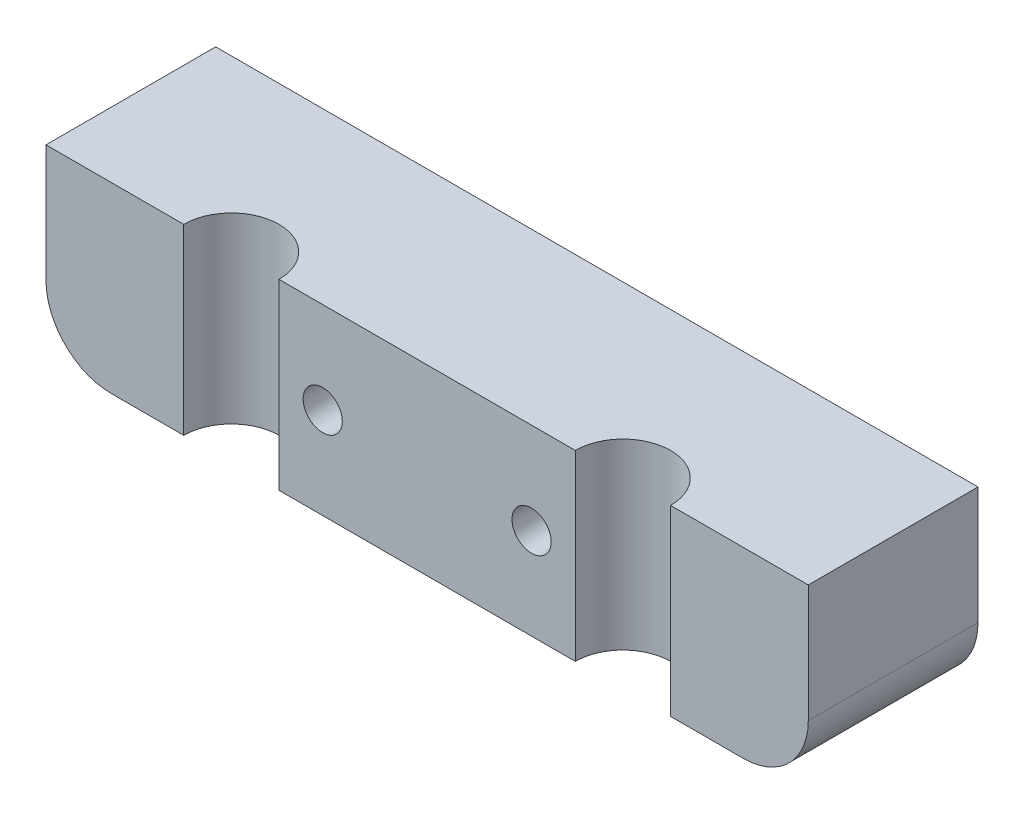
ISO-10303-21;
HEADER;
FILE_DESCRIPTION(('STEP AP214'),'2;1');
FILE_NAME('part.step','',(''),(''),'','','');
FILE_SCHEMA(('AUTOMOTIVE_DESIGN { 1 0 10303 214 1 1 1 1 }'));
ENDSEC;
DATA;
#1=APPLICATION_CONTEXT('core data for automotive mechanical design processes');
#2=APPLICATION_PROTOCOL_DEFINITION('international standard','automotive_design',2000,#1);
#3=PRODUCT_CONTEXT('',#1,'mechanical');
#4=PRODUCT('Part','Part','',(#3));
#5=PRODUCT_RELATED_PRODUCT_CATEGORY('part','',(#4));
#6=PRODUCT_DEFINITION_FORMATION('','',#4);
#7=PRODUCT_DEFINITION_CONTEXT('part definition',#1,'design');
#8=PRODUCT_DEFINITION('design','',#6,#7);
#9=PRODUCT_DEFINITION_SHAPE('','',#8);
#10=(LENGTH_UNIT() NAMED_UNIT(*) SI_UNIT(.MILLI.,.METRE.));
#11=(NAMED_UNIT(*) PLANE_ANGLE_UNIT() SI_UNIT($,.RADIAN.));
#12=(NAMED_UNIT(*) SI_UNIT($,.STERADIAN.) SOLID_ANGLE_UNIT());
#13=UNCERTAINTY_MEASURE_WITH_UNIT(LENGTH_MEASURE(1.E-05),#10,'distance_accuracy_value','');
#14=(GEOMETRIC_REPRESENTATION_CONTEXT(3) GLOBAL_UNCERTAINTY_ASSIGNED_CONTEXT((#13)) GLOBAL_UNIT_ASSIGNED_CONTEXT((#10,
#11,#12)) REPRESENTATION_CONTEXT('',''));
#15=CARTESIAN_POINT('',(0.,0.,0.));
#16=DIRECTION('',(0.,0.,1.));
#17=DIRECTION('',(1.,0.,0.));
#18=AXIS2_PLACEMENT_3D('',#15,#16,#17);
#19=CARTESIAN_POINT('',(8.,0.,-0.000999999999999265));
#20=DIRECTION('',(0.,0.,1.));
#21=DIRECTION('',(1.,0.,0.));
#22=AXIS2_PLACEMENT_3D('',#19,#20,#21);
#23=CYLINDRICAL_SURFACE('',#22,1.5);
#24=CARTESIAN_POINT('',(8.,0.,13.));
#25=DIRECTION('',(0.,0.,1.));
#26=DIRECTION('',(-1.,0.,0.));
#27=AXIS2_PLACEMENT_3D('',#24,#25,#26);
#28=CIRCLE('',#27,1.5);
#29=CARTESIAN_POINT('',(6.5,0.,13.));
#30=VERTEX_POINT('',#29);
#31=EDGE_CURVE('E207',#30,#30,#28,.T.);
#32=ORIENTED_EDGE('',*,*,#31,.T.);
#33=EDGE_LOOP('',(#32));
#34=FACE_BOUND('',#33,.T.);
#35=CARTESIAN_POINT('',(8.,0.,3.8));
#36=DIRECTION('',(0.,0.,-1.));
#37=DIRECTION('',(-1.,0.,0.));
#38=AXIS2_PLACEMENT_3D('',#35,#36,#37);
#39=CIRCLE('',#38,1.5);
#40=CARTESIAN_POINT('',(6.5,0.,3.8));
#41=VERTEX_POINT('',#40);
#42=EDGE_CURVE('E167',#41,#41,#39,.F.);
#43=ORIENTED_EDGE('',*,*,#42,.F.);
#44=EDGE_LOOP('',(#43));
#45=FACE_BOUND('',#44,.T.);
#46=ADVANCED_FACE('F33',(#34,#45),#23,.F.);
#47=CARTESIAN_POINT('',(-8.,0.,-0.000999999999999265));
#48=DIRECTION('',(0.,0.,1.));
#49=DIRECTION('',(1.,0.,0.));
#50=AXIS2_PLACEMENT_3D('',#47,#48,#49);
#51=CYLINDRICAL_SURFACE('',#50,1.5);
#52=CARTESIAN_POINT('',(-8.,0.,13.));
#53=DIRECTION('',(0.,0.,1.));
#54=DIRECTION('',(1.,0.,0.));
#55=AXIS2_PLACEMENT_3D('',#52,#53,#54);
#56=CIRCLE('',#55,1.5);
#57=CARTESIAN_POINT('',(-6.5,0.,13.));
#58=VERTEX_POINT('',#57);
#59=EDGE_CURVE('E153',#58,#58,#56,.T.);
#60=ORIENTED_EDGE('',*,*,#59,.T.);
#61=EDGE_LOOP('',(#60));
#62=FACE_BOUND('',#61,.T.);
#63=CARTESIAN_POINT('',(-8.,0.,3.8));
#64=DIRECTION('',(0.,0.,-1.));
#65=DIRECTION('',(-1.,0.,0.));
#66=AXIS2_PLACEMENT_3D('',#63,#64,#65);
#67=CIRCLE('',#66,1.5);
#68=CARTESIAN_POINT('',(-9.5,0.,3.8));
#69=VERTEX_POINT('',#68);
#70=EDGE_CURVE('E164',#69,#69,#67,.F.);
#71=ORIENTED_EDGE('',*,*,#70,.F.);
#72=EDGE_LOOP('',(#71));
#73=FACE_BOUND('',#72,.T.);
#74=ADVANCED_FACE('F229',(#62,#73),#51,.F.);
#75=CARTESIAN_POINT('',(0.,0.,13.));
#76=DIRECTION('',(0.,0.,-1.));
#77=DIRECTION('',(-1.,0.,0.));
#78=AXIS2_PLACEMENT_3D('',#75,#76,#77);
#79=PLANE('',#78);
#80=DIRECTION('',(0.,-1.,0.));
#81=VECTOR('',#80,1.);
#82=CARTESIAN_POINT('',(-29.2,-7.,13.));
#83=LINE('',#82,#81);
#84=CARTESIAN_POINT('',(-29.2,7.,13.));
#85=VERTEX_POINT('',#84);
#86=CARTESIAN_POINT('',(-29.2,-2.,13.));
#87=VERTEX_POINT('',#86);
#88=EDGE_CURVE('E142',#85,#87,#83,.T.);
#89=ORIENTED_EDGE('',*,*,#88,.T.);
#90=CARTESIAN_POINT('',(-24.2,-2.,13.));
#91=DIRECTION('',(0.,0.,-1.));
#92=DIRECTION('',(-1.,0.,0.));
#93=AXIS2_PLACEMENT_3D('',#90,#91,#92);
#94=CIRCLE('',#93,5.);
#95=CARTESIAN_POINT('',(-24.2,-7.,13.));
#96=VERTEX_POINT('',#95);
#97=EDGE_CURVE('E181',#87,#96,#94,.F.);
#98=ORIENTED_EDGE('',*,*,#97,.T.);
#99=DIRECTION('',(1.,0.,0.));
#100=VECTOR('',#99,1.);
#101=CARTESIAN_POINT('',(-29.2,-7.,13.));
#102=LINE('',#101,#100);
#103=CARTESIAN_POINT('',(-18.65,-7.,13.));
#104=VERTEX_POINT('',#103);
#105=EDGE_CURVE('E129',#96,#104,#102,.T.);
#106=ORIENTED_EDGE('',*,*,#105,.T.);
#107=DIRECTION('',(0.,1.,0.));
#108=VECTOR('',#107,1.);
#109=CARTESIAN_POINT('',(-18.65,-7.001,13.));
#110=LINE('',#109,#108);
#111=CARTESIAN_POINT('',(-18.65,7.,13.));
#112=VERTEX_POINT('',#111);
#113=EDGE_CURVE('E114',#112,#104,#110,.F.);
#114=ORIENTED_EDGE('',*,*,#113,.F.);
#115=DIRECTION('',(-1.,0.,0.));
#116=VECTOR('',#115,1.);
#117=CARTESIAN_POINT('',(-29.2,7.,13.));
#118=LINE('',#117,#116);
#119=EDGE_CURVE('E126',#112,#85,#118,.T.);
#120=ORIENTED_EDGE('',*,*,#119,.T.);
#121=EDGE_LOOP('',(#89,#98,#106,#114,#120));
#122=FACE_BOUND('',#121,.T.);
#123=ADVANCED_FACE('F125',(#122),#79,.F.);
#124=ORIENTED_EDGE('',*,*,#31,.F.);
#125=EDGE_LOOP('',(#124));
#126=FACE_BOUND('',#125,.T.);
#127=ORIENTED_EDGE('',*,*,#59,.F.);
#128=EDGE_LOOP('',(#127));
#129=FACE_BOUND('',#128,.T.);
#130=CARTESIAN_POINT('',(11.35,7.,13.));
#131=VERTEX_POINT('',#130);
#132=CARTESIAN_POINT('',(-11.35,7.,13.));
#133=VERTEX_POINT('',#132);
#134=EDGE_CURVE('E134',#131,#133,#118,.T.);
#135=ORIENTED_EDGE('',*,*,#134,.T.);
#136=DIRECTION('',(0.,1.,0.));
#137=VECTOR('',#136,1.);
#138=CARTESIAN_POINT('',(-11.35,-7.001,13.));
#139=LINE('',#138,#137);
#140=CARTESIAN_POINT('',(-11.35,-7.,13.));
#141=VERTEX_POINT('',#140);
#142=EDGE_CURVE('E117',#141,#133,#139,.T.);
#143=ORIENTED_EDGE('',*,*,#142,.F.);
#144=CARTESIAN_POINT('',(11.35,-7.,13.));
#145=VERTEX_POINT('',#144);
#146=EDGE_CURVE('E147',#141,#145,#102,.T.);
#147=ORIENTED_EDGE('',*,*,#146,.T.);
#148=DIRECTION('',(0.,1.,0.));
#149=VECTOR('',#148,1.);
#150=CARTESIAN_POINT('',(11.35,-7.001,13.));
#151=LINE('',#150,#149);
#152=EDGE_CURVE('E199',#131,#145,#151,.F.);
#153=ORIENTED_EDGE('',*,*,#152,.F.);
#154=EDGE_LOOP('',(#135,#143,#147,#153));
#155=FACE_BOUND('',#154,.T.);
#156=ADVANCED_FACE('F241',(#126,#129,#155),#79,.F.);
#157=CARTESIAN_POINT('',(29.2,-7.,13.));
#158=DIRECTION('',(-1.,0.,0.));
#159=DIRECTION('',(0.,0.,1.));
#160=AXIS2_PLACEMENT_3D('',#157,#158,#159);
#161=PLANE('',#160);
#162=DIRECTION('',(0.,1.,0.));
#163=VECTOR('',#162,1.);
#164=CARTESIAN_POINT('',(29.2,-7.,13.));
#165=LINE('',#164,#163);
#166=CARTESIAN_POINT('',(29.2,-2.,13.));
#167=VERTEX_POINT('',#166);
#168=CARTESIAN_POINT('',(29.2,7.,13.));
#169=VERTEX_POINT('',#168);
#170=EDGE_CURVE('E135',#167,#169,#165,.T.);
#171=ORIENTED_EDGE('',*,*,#170,.F.);
#172=DIRECTION('',(0.,0.,-1.));
#173=VECTOR('',#172,1.);
#174=CARTESIAN_POINT('',(29.2,-2.,13.));
#175=LINE('',#174,#173);
#176=CARTESIAN_POINT('',(29.2,-2.,0.));
#177=VERTEX_POINT('',#176);
#178=EDGE_CURVE('E41',#167,#177,#175,.T.);
#179=ORIENTED_EDGE('',*,*,#178,.T.);
#180=DIRECTION('',(0.,1.,0.));
#181=VECTOR('',#180,1.);
#182=CARTESIAN_POINT('',(29.2,-7.,0.));
#183=LINE('',#182,#181);
#184=CARTESIAN_POINT('',(29.2,7.,0.));
#185=VERTEX_POINT('',#184);
#186=EDGE_CURVE('E150',#177,#185,#183,.T.);
#187=ORIENTED_EDGE('',*,*,#186,.T.);
#188=DIRECTION('',(0.,0.,-1.));
#189=VECTOR('',#188,1.);
#190=CARTESIAN_POINT('',(29.2,7.,13.));
#191=LINE('',#190,#189);
#192=EDGE_CURVE('E160',#169,#185,#191,.T.);
#193=ORIENTED_EDGE('',*,*,#192,.F.);
#194=EDGE_LOOP('',(#171,#179,#187,#193));
#195=FACE_BOUND('',#194,.T.);
#196=ADVANCED_FACE('F186',(#195),#161,.F.);
#197=CARTESIAN_POINT('',(-29.2,7.,13.));
#198=DIRECTION('',(0.,-1.,0.));
#199=DIRECTION('',(0.,0.,-1.));
#200=AXIS2_PLACEMENT_3D('',#197,#198,#199);
#201=PLANE('',#200);
#202=ORIENTED_EDGE('',*,*,#119,.F.);
#203=CARTESIAN_POINT('',(-15.,7.,13.));
#204=DIRECTION('',(0.,1.,0.));
#205=DIRECTION('',(0.,0.,1.));
#206=AXIS2_PLACEMENT_3D('',#203,#204,#205);
#207=CIRCLE('',#206,3.65);
#208=EDGE_CURVE('E111',#133,#112,#207,.T.);
#209=ORIENTED_EDGE('',*,*,#208,.F.);
#210=ORIENTED_EDGE('',*,*,#134,.F.);
#211=CARTESIAN_POINT('',(15.,7.,13.));
#212=DIRECTION('',(0.,1.,0.));
#213=DIRECTION('',(0.,0.,-1.));
#214=AXIS2_PLACEMENT_3D('',#211,#212,#213);
#215=CIRCLE('',#214,3.65);
#216=CARTESIAN_POINT('',(18.65,7.,13.));
#217=VERTEX_POINT('',#216);
#218=EDGE_CURVE('E195',#217,#131,#215,.T.);
#219=ORIENTED_EDGE('',*,*,#218,.F.);
#220=EDGE_CURVE('E137',#169,#217,#118,.T.);
#221=ORIENTED_EDGE('',*,*,#220,.F.);
#222=ORIENTED_EDGE('',*,*,#192,.T.);
#223=DIRECTION('',(-1.,0.,0.));
#224=VECTOR('',#223,1.);
#225=CARTESIAN_POINT('',(-29.2,7.,0.));
#226=LINE('',#225,#224);
#227=CARTESIAN_POINT('',(-29.2,7.,0.));
#228=VERTEX_POINT('',#227);
#229=EDGE_CURVE('E152',#185,#228,#226,.T.);
#230=ORIENTED_EDGE('',*,*,#229,.T.);
#231=DIRECTION('',(0.,0.,-1.));
#232=VECTOR('',#231,1.);
#233=CARTESIAN_POINT('',(-29.2,7.,13.));
#234=LINE('',#233,#232);
#235=EDGE_CURVE('E133',#85,#228,#234,.T.);
#236=ORIENTED_EDGE('',*,*,#235,.F.);
#237=EDGE_LOOP('',(#202,#209,#210,#219,#221,#222,#230,#236));
#238=FACE_BOUND('',#237,.T.);
#239=ADVANCED_FACE('F131',(#238),#201,.F.);
#240=CARTESIAN_POINT('',(-29.2,-7.,13.));
#241=DIRECTION('',(1.,0.,0.));
#242=DIRECTION('',(0.,0.,-1.));
#243=AXIS2_PLACEMENT_3D('',#240,#241,#242);
#244=PLANE('',#243);
#245=DIRECTION('',(0.,-1.,0.));
#246=VECTOR('',#245,1.);
#247=CARTESIAN_POINT('',(-29.2,-7.,0.));
#248=LINE('',#247,#246);
#249=CARTESIAN_POINT('',(-29.2,-2.,0.));
#250=VERTEX_POINT('',#249);
#251=EDGE_CURVE('E155',#228,#250,#248,.T.);
#252=ORIENTED_EDGE('',*,*,#251,.T.);
#253=DIRECTION('',(0.,0.,-1.));
#254=VECTOR('',#253,1.);
#255=CARTESIAN_POINT('',(-29.2,-2.,13.));
#256=LINE('',#255,#254);
#257=EDGE_CURVE('E54',#250,#87,#256,.F.);
#258=ORIENTED_EDGE('',*,*,#257,.T.);
#259=ORIENTED_EDGE('',*,*,#88,.F.);
#260=ORIENTED_EDGE('',*,*,#235,.T.);
#261=EDGE_LOOP('',(#252,#258,#259,#260));
#262=FACE_BOUND('',#261,.T.);
#263=ADVANCED_FACE('F247',(#262),#244,.F.);
#264=CARTESIAN_POINT('',(-29.2,-7.,13.));
#265=DIRECTION('',(0.,1.,0.));
#266=DIRECTION('',(0.,0.,1.));
#267=AXIS2_PLACEMENT_3D('',#264,#265,#266);
#268=PLANE('',#267);
#269=ORIENTED_EDGE('',*,*,#105,.F.);
#270=DIRECTION('',(0.,0.,-1.));
#271=VECTOR('',#270,1.);
#272=CARTESIAN_POINT('',(-24.2,-7.,13.));
#273=LINE('',#272,#271);
#274=CARTESIAN_POINT('',(-24.2,-7.,0.));
#275=VERTEX_POINT('',#274);
#276=EDGE_CURVE('E173',#96,#275,#273,.T.);
#277=ORIENTED_EDGE('',*,*,#276,.T.);
#278=DIRECTION('',(1.,0.,0.));
#279=VECTOR('',#278,1.);
#280=CARTESIAN_POINT('',(-29.2,-7.,0.));
#281=LINE('',#280,#279);
#282=CARTESIAN_POINT('',(24.2,-7.,0.));
#283=VERTEX_POINT('',#282);
#284=EDGE_CURVE('E138',#275,#283,#281,.T.);
#285=ORIENTED_EDGE('',*,*,#284,.T.);
#286=DIRECTION('',(0.,0.,-1.));
#287=VECTOR('',#286,1.);
#288=CARTESIAN_POINT('',(24.2,-7.,13.));
#289=LINE('',#288,#287);
#290=CARTESIAN_POINT('',(24.2,-7.,13.));
#291=VERTEX_POINT('',#290);
#292=EDGE_CURVE('E163',#283,#291,#289,.F.);
#293=ORIENTED_EDGE('',*,*,#292,.T.);
#294=CARTESIAN_POINT('',(18.65,-7.,13.));
#295=VERTEX_POINT('',#294);
#296=EDGE_CURVE('E145',#295,#291,#102,.T.);
#297=ORIENTED_EDGE('',*,*,#296,.F.);
#298=CARTESIAN_POINT('',(15.,-7.,13.));
#299=DIRECTION('',(0.,1.,0.));
#300=DIRECTION('',(0.,0.,1.));
#301=AXIS2_PLACEMENT_3D('',#298,#299,#300);
#302=CIRCLE('',#301,3.65);
#303=EDGE_CURVE('E198',#145,#295,#302,.F.);
#304=ORIENTED_EDGE('',*,*,#303,.F.);
#305=ORIENTED_EDGE('',*,*,#146,.F.);
#306=CARTESIAN_POINT('',(-15.,-7.,13.));
#307=DIRECTION('',(0.,1.,0.));
#308=DIRECTION('',(0.,0.,1.));
#309=AXIS2_PLACEMENT_3D('',#306,#307,#308);
#310=CIRCLE('',#309,3.65);
#311=EDGE_CURVE('E122',#104,#141,#310,.F.);
#312=ORIENTED_EDGE('',*,*,#311,.F.);
#313=EDGE_LOOP('',(#269,#277,#285,#293,#297,#304,#305,#312));
#314=FACE_BOUND('',#313,.T.);
#315=ADVANCED_FACE('F217',(#314),#268,.F.);
#316=ORIENTED_EDGE('',*,*,#296,.T.);
#317=CARTESIAN_POINT('',(24.2,-2.,13.));
#318=DIRECTION('',(0.,0.,-1.));
#319=DIRECTION('',(-1.,0.,0.));
#320=AXIS2_PLACEMENT_3D('',#317,#318,#319);
#321=CIRCLE('',#320,5.);
#322=EDGE_CURVE('E11',#291,#167,#321,.F.);
#323=ORIENTED_EDGE('',*,*,#322,.T.);
#324=ORIENTED_EDGE('',*,*,#170,.T.);
#325=ORIENTED_EDGE('',*,*,#220,.T.);
#326=DIRECTION('',(0.,1.,0.));
#327=VECTOR('',#326,1.);
#328=CARTESIAN_POINT('',(18.65,-7.001,13.));
#329=LINE('',#328,#327);
#330=EDGE_CURVE('E171',#295,#217,#329,.T.);
#331=ORIENTED_EDGE('',*,*,#330,.F.);
#332=EDGE_LOOP('',(#316,#323,#324,#325,#331));
#333=FACE_BOUND('',#332,.T.);
#334=ADVANCED_FACE('F215',(#333),#79,.F.);
#335=CARTESIAN_POINT('',(0.,0.,0.));
#336=DIRECTION('',(0.,0.,-1.));
#337=DIRECTION('',(-1.,0.,0.));
#338=AXIS2_PLACEMENT_3D('',#335,#336,#337);
#339=PLANE('',#338);
#340=CARTESIAN_POINT('',(8.,0.,0.));
#341=DIRECTION('',(0.,0.,-1.));
#342=DIRECTION('',(-1.,0.,0.));
#343=AXIS2_PLACEMENT_3D('',#340,#341,#342);
#344=CIRCLE('',#343,3.);
#345=CARTESIAN_POINT('',(5.,0.,0.));
#346=VERTEX_POINT('',#345);
#347=EDGE_CURVE('E272',#346,#346,#344,.T.);
#348=ORIENTED_EDGE('',*,*,#347,.F.);
#349=EDGE_LOOP('',(#348));
#350=FACE_BOUND('',#349,.T.);
#351=CARTESIAN_POINT('',(-8.,0.,0.));
#352=DIRECTION('',(0.,0.,-1.));
#353=DIRECTION('',(-1.,0.,0.));
#354=AXIS2_PLACEMENT_3D('',#351,#352,#353);
#355=CIRCLE('',#354,3.);
#356=CARTESIAN_POINT('',(-11.,0.,0.));
#357=VERTEX_POINT('',#356);
#358=EDGE_CURVE('E266',#357,#357,#355,.T.);
#359=ORIENTED_EDGE('',*,*,#358,.F.);
#360=EDGE_LOOP('',(#359));
#361=FACE_BOUND('',#360,.T.);
#362=ORIENTED_EDGE('',*,*,#284,.F.);
#363=CARTESIAN_POINT('',(-24.2,-2.,0.));
#364=DIRECTION('',(0.,0.,-1.));
#365=DIRECTION('',(-1.,0.,0.));
#366=AXIS2_PLACEMENT_3D('',#363,#364,#365);
#367=CIRCLE('',#366,5.);
#368=EDGE_CURVE('E178',#275,#250,#367,.T.);
#369=ORIENTED_EDGE('',*,*,#368,.T.);
#370=ORIENTED_EDGE('',*,*,#251,.F.);
#371=ORIENTED_EDGE('',*,*,#229,.F.);
#372=ORIENTED_EDGE('',*,*,#186,.F.);
#373=CARTESIAN_POINT('',(24.2,-2.,0.));
#374=DIRECTION('',(0.,0.,-1.));
#375=DIRECTION('',(-1.,0.,0.));
#376=AXIS2_PLACEMENT_3D('',#373,#374,#375);
#377=CIRCLE('',#376,5.);
#378=EDGE_CURVE('E176',#177,#283,#377,.T.);
#379=ORIENTED_EDGE('',*,*,#378,.T.);
#380=EDGE_LOOP('',(#362,#369,#370,#371,#372,#379));
#381=FACE_BOUND('',#380,.T.);
#382=ADVANCED_FACE('F192',(#350,#361,#381),#339,.T.);
#383=CARTESIAN_POINT('',(15.,-7.001,13.));
#384=DIRECTION('',(0.,1.,0.));
#385=DIRECTION('',(0.,0.,1.));
#386=AXIS2_PLACEMENT_3D('',#383,#384,#385);
#387=CYLINDRICAL_SURFACE('',#386,3.65);
#388=ORIENTED_EDGE('',*,*,#152,.T.);
#389=ORIENTED_EDGE('',*,*,#303,.T.);
#390=ORIENTED_EDGE('',*,*,#330,.T.);
#391=ORIENTED_EDGE('',*,*,#218,.T.);
#392=EDGE_LOOP('',(#388,#389,#390,#391));
#393=FACE_BOUND('',#392,.T.);
#394=ADVANCED_FACE('F212',(#393),#387,.F.);
#395=CARTESIAN_POINT('',(-15.,-7.001,13.));
#396=DIRECTION('',(0.,1.,0.));
#397=DIRECTION('',(0.,0.,1.));
#398=AXIS2_PLACEMENT_3D('',#395,#396,#397);
#399=CYLINDRICAL_SURFACE('',#398,3.65);
#400=ORIENTED_EDGE('',*,*,#113,.T.);
#401=ORIENTED_EDGE('',*,*,#311,.T.);
#402=ORIENTED_EDGE('',*,*,#142,.T.);
#403=ORIENTED_EDGE('',*,*,#208,.T.);
#404=EDGE_LOOP('',(#400,#401,#402,#403));
#405=FACE_BOUND('',#404,.T.);
#406=ADVANCED_FACE('F113',(#405),#399,.F.);
#407=CARTESIAN_POINT('',(-8.,0.,3.8));
#408=DIRECTION('',(0.,0.,-1.));
#409=DIRECTION('',(-1.,0.,0.));
#410=AXIS2_PLACEMENT_3D('',#407,#408,#409);
#411=PLANE('',#410);
#412=CARTESIAN_POINT('',(-8.,0.,3.8));
#413=DIRECTION('',(0.,0.,-1.));
#414=DIRECTION('',(-1.,0.,0.));
#415=AXIS2_PLACEMENT_3D('',#412,#413,#414);
#416=CIRCLE('',#415,3.);
#417=CARTESIAN_POINT('',(-11.,0.,3.8));
#418=VERTEX_POINT('',#417);
#419=EDGE_CURVE('E269',#418,#418,#416,.T.);
#420=ORIENTED_EDGE('',*,*,#419,.T.);
#421=EDGE_LOOP('',(#420));
#422=FACE_BOUND('',#421,.T.);
#423=ORIENTED_EDGE('',*,*,#70,.T.);
#424=EDGE_LOOP('',(#423));
#425=FACE_BOUND('',#424,.T.);
#426=ADVANCED_FACE('F290',(#422,#425),#411,.T.);
#427=CARTESIAN_POINT('',(-8.,0.,3.8));
#428=DIRECTION('',(0.,0.,-1.));
#429=DIRECTION('',(-1.,0.,0.));
#430=AXIS2_PLACEMENT_3D('',#427,#428,#429);
#431=CYLINDRICAL_SURFACE('',#430,3.);
#432=CARTESIAN_POINT('',(-11.,0.,3.8));
#433=CARTESIAN_POINT('',(-11.,0.,3.76041666666667));
#434=CARTESIAN_POINT('',(-11.,0.,3.72083333333333));
#435=CARTESIAN_POINT('',(-11.,0.,3.64166666666667));
#436=CARTESIAN_POINT('',(-11.,0.,3.60208333333333));
#437=CARTESIAN_POINT('',(-11.,0.,3.52291666666667));
#438=CARTESIAN_POINT('',(-11.,0.,3.48333333333333));
#439=CARTESIAN_POINT('',(-11.,0.,3.40416666666667));
#440=CARTESIAN_POINT('',(-11.,0.,3.36458333333333));
#441=CARTESIAN_POINT('',(-11.,0.,3.28541666666667));
#442=CARTESIAN_POINT('',(-11.,0.,3.24583333333333));
#443=CARTESIAN_POINT('',(-11.,0.,3.16666666666667));
#444=CARTESIAN_POINT('',(-11.,0.,3.12708333333333));
#445=CARTESIAN_POINT('',(-11.,0.,3.04791666666667));
#446=CARTESIAN_POINT('',(-11.,0.,3.00833333333333));
#447=CARTESIAN_POINT('',(-11.,0.,2.92916666666667));
#448=CARTESIAN_POINT('',(-11.,0.,2.88958333333333));
#449=CARTESIAN_POINT('',(-11.,0.,2.81041666666667));
#450=CARTESIAN_POINT('',(-11.,0.,2.77083333333333));
#451=CARTESIAN_POINT('',(-11.,0.,2.69166666666667));
#452=CARTESIAN_POINT('',(-11.,0.,2.65208333333333));
#453=CARTESIAN_POINT('',(-11.,0.,2.57291666666667));
#454=CARTESIAN_POINT('',(-11.,0.,2.53333333333333));
#455=CARTESIAN_POINT('',(-11.,0.,2.45416666666667));
#456=CARTESIAN_POINT('',(-11.,0.,2.41458333333333));
#457=CARTESIAN_POINT('',(-11.,0.,2.33541666666667));
#458=CARTESIAN_POINT('',(-11.,0.,2.29583333333333));
#459=CARTESIAN_POINT('',(-11.,0.,2.21666666666667));
#460=CARTESIAN_POINT('',(-11.,0.,2.17708333333333));
#461=CARTESIAN_POINT('',(-11.,0.,2.09791666666667));
#462=CARTESIAN_POINT('',(-11.,0.,2.05833333333333));
#463=CARTESIAN_POINT('',(-11.,0.,1.97916666666667));
#464=CARTESIAN_POINT('',(-11.,0.,1.93958333333333));
#465=CARTESIAN_POINT('',(-11.,0.,1.86041666666667));
#466=CARTESIAN_POINT('',(-11.,0.,1.82083333333333));
#467=CARTESIAN_POINT('',(-11.,0.,1.74166666666667));
#468=CARTESIAN_POINT('',(-11.,0.,1.70208333333333));
#469=CARTESIAN_POINT('',(-11.,0.,1.62291666666667));
#470=CARTESIAN_POINT('',(-11.,0.,1.58333333333333));
#471=CARTESIAN_POINT('',(-11.,0.,1.50416666666667));
#472=CARTESIAN_POINT('',(-11.,0.,1.46458333333333));
#473=CARTESIAN_POINT('',(-11.,0.,1.38541666666667));
#474=CARTESIAN_POINT('',(-11.,0.,1.34583333333333));
#475=CARTESIAN_POINT('',(-11.,0.,1.26666666666667));
#476=CARTESIAN_POINT('',(-11.,0.,1.22708333333333));
#477=CARTESIAN_POINT('',(-11.,0.,1.14791666666667));
#478=CARTESIAN_POINT('',(-11.,0.,1.10833333333333));
#479=CARTESIAN_POINT('',(-11.,0.,1.02916666666667));
#480=CARTESIAN_POINT('',(-11.,0.,0.989583333333334));
#481=CARTESIAN_POINT('',(-11.,0.,0.910416666666667));
#482=CARTESIAN_POINT('',(-11.,0.,0.870833333333334));
#483=CARTESIAN_POINT('',(-11.,0.,0.791666666666667));
#484=CARTESIAN_POINT('',(-11.,0.,0.752083333333333));
#485=CARTESIAN_POINT('',(-11.,0.,0.672916666666667));
#486=CARTESIAN_POINT('',(-11.,0.,0.633333333333333));
#487=CARTESIAN_POINT('',(-11.,0.,0.554166666666667));
#488=CARTESIAN_POINT('',(-11.,0.,0.514583333333334));
#489=CARTESIAN_POINT('',(-11.,0.,0.435416666666667));
#490=CARTESIAN_POINT('',(-11.,0.,0.395833333333334));
#491=CARTESIAN_POINT('',(-11.,0.,0.316666666666667));
#492=CARTESIAN_POINT('',(-11.,0.,0.277083333333333));
#493=CARTESIAN_POINT('',(-11.,0.,0.197916666666667));
#494=CARTESIAN_POINT('',(-11.,0.,0.158333333333333));
#495=CARTESIAN_POINT('',(-11.,0.,0.0791666666666666));
#496=CARTESIAN_POINT('',(-11.,0.,0.0395833333333333));
#497=CARTESIAN_POINT('',(-11.,0.,0.));
#498=B_SPLINE_CURVE_WITH_KNOTS('',3,(#432,#433,#434,#435,#436,#437,#438,#439,#440,#441,#442,
#443,#444,#445,#446,#447,#448,#449,#450,#451,#452,#453,#454,#455,#456,#457,#458,#459,#460,#461,
#462,#463,#464,#465,#466,#467,#468,#469,#470,#471,#472,#473,#474,#475,#476,#477,#478,#479,#480,
#481,#482,#483,#484,#485,#486,#487,#488,#489,#490,#491,#492,#493,#494,#495,#496,#497),
.UNSPECIFIED.,.F.,.F.,(4,2,2,2,2,2,2,2,2,2,2,2,2,2,2,2,2,2,2,2,2,2,2,2,2,2,2,2,2,2,2,2,4),(0.,
0.11875,0.2375,0.35625,0.475,0.59375,0.7125,0.83125,0.95,1.06875,1.1875,1.30625,1.425,1.54375,
1.6625,1.78125,1.9,2.01875,2.1375,2.25625,2.375,2.49375,2.6125,2.73125,2.85,2.96875,3.0875,
3.20625,3.325,3.44375,3.5625,3.68125,3.8),.UNSPECIFIED.);
#499=EDGE_CURVE('BSEAM288',#418,#357,#498,.T.);
#500=ORIENTED_EDGE('',*,*,#419,.F.);
#501=ORIENTED_EDGE('',*,*,#358,.T.);
#502=ORIENTED_EDGE('',*,*,#499,.T.);
#503=ORIENTED_EDGE('',*,*,#499,.F.);
#504=EDGE_LOOP('',(#500,#502,#501,#503));
#505=FACE_BOUND('',#504,.T.);
#506=ADVANCED_FACE('F288',(#505),#431,.F.);
#507=CARTESIAN_POINT('',(8.,0.,3.8));
#508=DIRECTION('',(0.,0.,-1.));
#509=DIRECTION('',(-1.,0.,0.));
#510=AXIS2_PLACEMENT_3D('',#507,#508,#509);
#511=PLANE('',#510);
#512=CARTESIAN_POINT('',(8.,0.,3.8));
#513=DIRECTION('',(0.,0.,-1.));
#514=DIRECTION('',(-1.,0.,0.));
#515=AXIS2_PLACEMENT_3D('',#512,#513,#514);
#516=CIRCLE('',#515,3.);
#517=CARTESIAN_POINT('',(5.,0.,3.8));
#518=VERTEX_POINT('',#517);
#519=EDGE_CURVE('E168',#518,#518,#516,.T.);
#520=ORIENTED_EDGE('',*,*,#519,.T.);
#521=EDGE_LOOP('',(#520));
#522=FACE_BOUND('',#521,.T.);
#523=ORIENTED_EDGE('',*,*,#42,.T.);
#524=EDGE_LOOP('',(#523));
#525=FACE_BOUND('',#524,.T.);
#526=ADVANCED_FACE('F278',(#522,#525),#511,.T.);
#527=CARTESIAN_POINT('',(8.,0.,3.8));
#528=DIRECTION('',(0.,0.,-1.));
#529=DIRECTION('',(-1.,0.,0.));
#530=AXIS2_PLACEMENT_3D('',#527,#528,#529);
#531=CYLINDRICAL_SURFACE('',#530,3.);
#532=CARTESIAN_POINT('',(5.,0.,3.8));
#533=CARTESIAN_POINT('',(5.,0.,3.76041666666667));
#534=CARTESIAN_POINT('',(5.,0.,3.72083333333333));
#535=CARTESIAN_POINT('',(5.,0.,3.64166666666667));
#536=CARTESIAN_POINT('',(5.,0.,3.60208333333333));
#537=CARTESIAN_POINT('',(5.,0.,3.52291666666667));
#538=CARTESIAN_POINT('',(5.,0.,3.48333333333333));
#539=CARTESIAN_POINT('',(5.,0.,3.40416666666667));
#540=CARTESIAN_POINT('',(5.,0.,3.36458333333333));
#541=CARTESIAN_POINT('',(5.,0.,3.28541666666667));
#542=CARTESIAN_POINT('',(5.,0.,3.24583333333333));
#543=CARTESIAN_POINT('',(5.,0.,3.16666666666667));
#544=CARTESIAN_POINT('',(5.,0.,3.12708333333333));
#545=CARTESIAN_POINT('',(5.,0.,3.04791666666667));
#546=CARTESIAN_POINT('',(5.,0.,3.00833333333333));
#547=CARTESIAN_POINT('',(5.,0.,2.92916666666667));
#548=CARTESIAN_POINT('',(5.,0.,2.88958333333333));
#549=CARTESIAN_POINT('',(5.,0.,2.81041666666667));
#550=CARTESIAN_POINT('',(5.,0.,2.77083333333333));
#551=CARTESIAN_POINT('',(5.,0.,2.69166666666667));
#552=CARTESIAN_POINT('',(5.,0.,2.65208333333333));
#553=CARTESIAN_POINT('',(5.,0.,2.57291666666667));
#554=CARTESIAN_POINT('',(5.,0.,2.53333333333333));
#555=CARTESIAN_POINT('',(5.,0.,2.45416666666667));
#556=CARTESIAN_POINT('',(5.,0.,2.41458333333333));
#557=CARTESIAN_POINT('',(5.,0.,2.33541666666667));
#558=CARTESIAN_POINT('',(5.,0.,2.29583333333333));
#559=CARTESIAN_POINT('',(5.,0.,2.21666666666667));
#560=CARTESIAN_POINT('',(5.,0.,2.17708333333333));
#561=CARTESIAN_POINT('',(5.,0.,2.09791666666667));
#562=CARTESIAN_POINT('',(5.,0.,2.05833333333333));
#563=CARTESIAN_POINT('',(5.,0.,1.97916666666667));
#564=CARTESIAN_POINT('',(5.,0.,1.93958333333333));
#565=CARTESIAN_POINT('',(5.,0.,1.86041666666667));
#566=CARTESIAN_POINT('',(5.,0.,1.82083333333333));
#567=CARTESIAN_POINT('',(5.,0.,1.74166666666667));
#568=CARTESIAN_POINT('',(5.,0.,1.70208333333333));
#569=CARTESIAN_POINT('',(5.,0.,1.62291666666667));
#570=CARTESIAN_POINT('',(5.,0.,1.58333333333333));
#571=CARTESIAN_POINT('',(5.,0.,1.50416666666667));
#572=CARTESIAN_POINT('',(5.,0.,1.46458333333333));
#573=CARTESIAN_POINT('',(5.,0.,1.38541666666667));
#574=CARTESIAN_POINT('',(5.,0.,1.34583333333333));
#575=CARTESIAN_POINT('',(5.,0.,1.26666666666667));
#576=CARTESIAN_POINT('',(5.,0.,1.22708333333333));
#577=CARTESIAN_POINT('',(5.,0.,1.14791666666667));
#578=CARTESIAN_POINT('',(5.,0.,1.10833333333333));
#579=CARTESIAN_POINT('',(5.,0.,1.02916666666667));
#580=CARTESIAN_POINT('',(5.,0.,0.989583333333334));
#581=CARTESIAN_POINT('',(5.,0.,0.910416666666667));
#582=CARTESIAN_POINT('',(5.,0.,0.870833333333334));
#583=CARTESIAN_POINT('',(5.,0.,0.791666666666667));
#584=CARTESIAN_POINT('',(5.,0.,0.752083333333333));
#585=CARTESIAN_POINT('',(5.,0.,0.672916666666667));
#586=CARTESIAN_POINT('',(5.,0.,0.633333333333333));
#587=CARTESIAN_POINT('',(5.,0.,0.554166666666667));
#588=CARTESIAN_POINT('',(5.,0.,0.514583333333334));
#589=CARTESIAN_POINT('',(5.,0.,0.435416666666667));
#590=CARTESIAN_POINT('',(5.,0.,0.395833333333334));
#591=CARTESIAN_POINT('',(5.,0.,0.316666666666667));
#592=CARTESIAN_POINT('',(5.,0.,0.277083333333333));
#593=CARTESIAN_POINT('',(5.,0.,0.197916666666667));
#594=CARTESIAN_POINT('',(5.,0.,0.158333333333333));
#595=CARTESIAN_POINT('',(5.,0.,0.0791666666666666));
#596=CARTESIAN_POINT('',(5.,0.,0.0395833333333333));
#597=CARTESIAN_POINT('',(5.,0.,0.));
#598=B_SPLINE_CURVE_WITH_KNOTS('',3,(#532,#533,#534,#535,#536,#537,#538,#539,#540,#541,#542,
#543,#544,#545,#546,#547,#548,#549,#550,#551,#552,#553,#554,#555,#556,#557,#558,#559,#560,#561,
#562,#563,#564,#565,#566,#567,#568,#569,#570,#571,#572,#573,#574,#575,#576,#577,#578,#579,#580,
#581,#582,#583,#584,#585,#586,#587,#588,#589,#590,#591,#592,#593,#594,#595,#596,#597),
.UNSPECIFIED.,.F.,.F.,(4,2,2,2,2,2,2,2,2,2,2,2,2,2,2,2,2,2,2,2,2,2,2,2,2,2,2,2,2,2,2,2,4),(0.,
0.11875,0.2375,0.35625,0.475,0.59375,0.7125,0.83125,0.95,1.06875,1.1875,1.30625,1.425,1.54375,
1.6625,1.78125,1.9,2.01875,2.1375,2.25625,2.375,2.49375,2.6125,2.73125,2.85,2.96875,3.0875,
3.20625,3.325,3.44375,3.5625,3.68125,3.8),.UNSPECIFIED.);
#599=EDGE_CURVE('BSEAM226',#518,#346,#598,.T.);
#600=ORIENTED_EDGE('',*,*,#519,.F.);
#601=ORIENTED_EDGE('',*,*,#347,.T.);
#602=ORIENTED_EDGE('',*,*,#599,.T.);
#603=ORIENTED_EDGE('',*,*,#599,.F.);
#604=EDGE_LOOP('',(#600,#602,#601,#603));
#605=FACE_BOUND('',#604,.T.);
#606=ADVANCED_FACE('F226',(#605),#531,.F.);
#607=CARTESIAN_POINT('',(-24.2,-2.,13.));
#608=DIRECTION('',(0.,0.,-1.));
#609=DIRECTION('',(-1.,0.,0.));
#610=AXIS2_PLACEMENT_3D('',#607,#608,#609);
#611=CYLINDRICAL_SURFACE('',#610,5.);
#612=ORIENTED_EDGE('',*,*,#97,.F.);
#613=ORIENTED_EDGE('',*,*,#257,.F.);
#614=ORIENTED_EDGE('',*,*,#368,.F.);
#615=ORIENTED_EDGE('',*,*,#276,.F.);
#616=EDGE_LOOP('',(#612,#613,#614,#615));
#617=FACE_BOUND('',#616,.T.);
#618=ADVANCED_FACE('F222',(#617),#611,.T.);
#619=CARTESIAN_POINT('',(24.2,-2.,13.));
#620=DIRECTION('',(0.,0.,-1.));
#621=DIRECTION('',(-1.,0.,0.));
#622=AXIS2_PLACEMENT_3D('',#619,#620,#621);
#623=CYLINDRICAL_SURFACE('',#622,5.);
#624=ORIENTED_EDGE('',*,*,#322,.F.);
#625=ORIENTED_EDGE('',*,*,#292,.F.);
#626=ORIENTED_EDGE('',*,*,#378,.F.);
#627=ORIENTED_EDGE('',*,*,#178,.F.);
#628=EDGE_LOOP('',(#624,#625,#626,#627));
#629=FACE_BOUND('',#628,.T.);
#630=ADVANCED_FACE('F35',(#629),#623,.T.);
#631=CLOSED_SHELL('',(#46,#74,#123,#156,#196,#239,#263,#315,#334,#382,#394,#406,#426,#506,#526,
#606,#618,#630));
#632=MANIFOLD_SOLID_BREP('B2',#631);
#633=ADVANCED_BREP_SHAPE_REPRESENTATION('',(#18,#632),#14);
#634=SHAPE_DEFINITION_REPRESENTATION(#9,#633);
ENDSEC;
END-ISO-10303-21;
